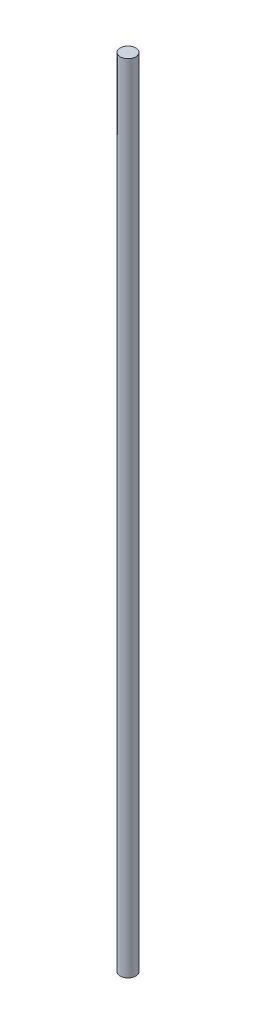
ISO-10303-21;
HEADER;
FILE_DESCRIPTION(('STEP AP214'),'2;1');
FILE_NAME('part.step','',(''),(''),'','','');
FILE_SCHEMA(('AUTOMOTIVE_DESIGN { 1 0 10303 214 1 1 1 1 }'));
ENDSEC;
DATA;
#1=APPLICATION_CONTEXT('core data for automotive mechanical design processes');
#2=APPLICATION_PROTOCOL_DEFINITION('international standard','automotive_design',2000,#1);
#3=PRODUCT_CONTEXT('',#1,'mechanical');
#4=PRODUCT('Part','Part','',(#3));
#5=PRODUCT_RELATED_PRODUCT_CATEGORY('part','',(#4));
#6=PRODUCT_DEFINITION_FORMATION('','',#4);
#7=PRODUCT_DEFINITION_CONTEXT('part definition',#1,'design');
#8=PRODUCT_DEFINITION('design','',#6,#7);
#9=PRODUCT_DEFINITION_SHAPE('','',#8);
#10=(LENGTH_UNIT() NAMED_UNIT(*) SI_UNIT(.MILLI.,.METRE.));
#11=(NAMED_UNIT(*) PLANE_ANGLE_UNIT() SI_UNIT($,.RADIAN.));
#12=(NAMED_UNIT(*) SI_UNIT($,.STERADIAN.) SOLID_ANGLE_UNIT());
#13=UNCERTAINTY_MEASURE_WITH_UNIT(LENGTH_MEASURE(1.E-05),#10,'distance_accuracy_value','');
#14=(GEOMETRIC_REPRESENTATION_CONTEXT(3) GLOBAL_UNCERTAINTY_ASSIGNED_CONTEXT((#13)) GLOBAL_UNIT_ASSIGNED_CONTEXT((#10,
#11,#12)) REPRESENTATION_CONTEXT('',''));
#15=CARTESIAN_POINT('',(0.,0.,0.));
#16=DIRECTION('',(0.,0.,1.));
#17=DIRECTION('',(1.,0.,0.));
#18=AXIS2_PLACEMENT_3D('',#15,#16,#17);
#19=CARTESIAN_POINT('',(0.,410.,0.));
#20=DIRECTION('',(0.,-1.,0.));
#21=DIRECTION('',(0.,0.,-1.));
#22=AXIS2_PLACEMENT_3D('',#19,#20,#21);
#23=CYLINDRICAL_SURFACE('',#22,4.);
#24=CARTESIAN_POINT('',(0.,410.,0.));
#25=DIRECTION('',(0.,1.,0.));
#26=DIRECTION('',(0.,0.,1.));
#27=AXIS2_PLACEMENT_3D('',#24,#25,#26);
#28=CIRCLE('',#27,4.);
#29=CARTESIAN_POINT('',(0.,410.,-4.));
#30=VERTEX_POINT('',#29);
#31=EDGE_CURVE('E10',#30,#30,#28,.T.);
#32=CARTESIAN_POINT('',(0.,0.,0.));
#33=DIRECTION('',(0.,1.,0.));
#34=DIRECTION('',(0.,0.,1.));
#35=AXIS2_PLACEMENT_3D('',#32,#33,#34);
#36=CIRCLE('',#35,4.);
#37=CARTESIAN_POINT('',(0.,0.,-4.));
#38=VERTEX_POINT('',#37);
#39=EDGE_CURVE('E34',#38,#38,#36,.T.);
#40=CARTESIAN_POINT('',(0.,410.,-4.));
#41=CARTESIAN_POINT('',(0.,405.729166666667,-4.));
#42=CARTESIAN_POINT('',(0.,401.458333333333,-4.));
#43=CARTESIAN_POINT('',(0.,392.916666666667,-4.));
#44=CARTESIAN_POINT('',(0.,388.645833333333,-4.));
#45=CARTESIAN_POINT('',(0.,380.104166666667,-4.));
#46=CARTESIAN_POINT('',(0.,375.833333333333,-4.));
#47=CARTESIAN_POINT('',(0.,367.291666666667,-4.));
#48=CARTESIAN_POINT('',(0.,363.020833333333,-4.));
#49=CARTESIAN_POINT('',(0.,354.479166666667,-4.));
#50=CARTESIAN_POINT('',(0.,350.208333333333,-4.));
#51=CARTESIAN_POINT('',(0.,341.666666666667,-4.));
#52=CARTESIAN_POINT('',(0.,337.395833333333,-4.));
#53=CARTESIAN_POINT('',(0.,328.854166666667,-4.));
#54=CARTESIAN_POINT('',(0.,324.583333333333,-4.));
#55=CARTESIAN_POINT('',(0.,316.041666666667,-4.));
#56=CARTESIAN_POINT('',(0.,311.770833333333,-4.));
#57=CARTESIAN_POINT('',(0.,303.229166666667,-4.));
#58=CARTESIAN_POINT('',(0.,298.958333333333,-4.));
#59=CARTESIAN_POINT('',(0.,290.416666666667,-4.));
#60=CARTESIAN_POINT('',(0.,286.145833333333,-4.));
#61=CARTESIAN_POINT('',(0.,277.604166666667,-4.));
#62=CARTESIAN_POINT('',(0.,273.333333333333,-4.));
#63=CARTESIAN_POINT('',(0.,264.791666666667,-4.));
#64=CARTESIAN_POINT('',(0.,260.520833333333,-4.));
#65=CARTESIAN_POINT('',(0.,251.979166666667,-4.));
#66=CARTESIAN_POINT('',(0.,247.708333333333,-4.));
#67=CARTESIAN_POINT('',(0.,239.166666666667,-4.));
#68=CARTESIAN_POINT('',(0.,234.895833333333,-4.));
#69=CARTESIAN_POINT('',(0.,226.354166666667,-4.));
#70=CARTESIAN_POINT('',(0.,222.083333333333,-4.));
#71=CARTESIAN_POINT('',(0.,213.541666666667,-4.));
#72=CARTESIAN_POINT('',(0.,209.270833333333,-4.));
#73=CARTESIAN_POINT('',(0.,200.729166666667,-4.));
#74=CARTESIAN_POINT('',(0.,196.458333333333,-4.));
#75=CARTESIAN_POINT('',(0.,187.916666666667,-4.));
#76=CARTESIAN_POINT('',(0.,183.645833333333,-4.));
#77=CARTESIAN_POINT('',(0.,175.104166666667,-4.));
#78=CARTESIAN_POINT('',(0.,170.833333333333,-4.));
#79=CARTESIAN_POINT('',(0.,162.291666666667,-4.));
#80=CARTESIAN_POINT('',(0.,158.020833333333,-4.));
#81=CARTESIAN_POINT('',(0.,149.479166666667,-4.));
#82=CARTESIAN_POINT('',(0.,145.208333333333,-4.));
#83=CARTESIAN_POINT('',(0.,136.666666666667,-4.));
#84=CARTESIAN_POINT('',(0.,132.395833333333,-4.));
#85=CARTESIAN_POINT('',(0.,123.854166666667,-4.));
#86=CARTESIAN_POINT('',(0.,119.583333333333,-4.));
#87=CARTESIAN_POINT('',(0.,111.041666666667,-4.));
#88=CARTESIAN_POINT('',(0.,106.770833333333,-4.));
#89=CARTESIAN_POINT('',(0.,98.2291666666667,-4.));
#90=CARTESIAN_POINT('',(0.,93.9583333333334,-4.));
#91=CARTESIAN_POINT('',(0.,85.4166666666667,-4.));
#92=CARTESIAN_POINT('',(0.,81.1458333333334,-4.));
#93=CARTESIAN_POINT('',(0.,72.6041666666667,-4.));
#94=CARTESIAN_POINT('',(0.,68.3333333333334,-4.));
#95=CARTESIAN_POINT('',(0.,59.7916666666667,-4.));
#96=CARTESIAN_POINT('',(0.,55.5208333333333,-4.));
#97=CARTESIAN_POINT('',(0.,46.9791666666667,-4.));
#98=CARTESIAN_POINT('',(0.,42.7083333333333,-4.));
#99=CARTESIAN_POINT('',(0.,34.1666666666667,-4.));
#100=CARTESIAN_POINT('',(0.,29.8958333333333,-4.));
#101=CARTESIAN_POINT('',(0.,21.3541666666667,-4.));
#102=CARTESIAN_POINT('',(0.,17.0833333333333,-4.));
#103=CARTESIAN_POINT('',(0.,8.54166666666667,-4.));
#104=CARTESIAN_POINT('',(0.,4.27083333333333,-4.));
#105=CARTESIAN_POINT('',(0.,0.,-4.));
#106=B_SPLINE_CURVE_WITH_KNOTS('',3,(#40,#41,#42,#43,#44,#45,#46,#47,#48,#49,#50,#51,#52,#53,
#54,#55,#56,#57,#58,#59,#60,#61,#62,#63,#64,#65,#66,#67,#68,#69,#70,#71,#72,#73,#74,#75,#76,#77,
#78,#79,#80,#81,#82,#83,#84,#85,#86,#87,#88,#89,#90,#91,#92,#93,#94,#95,#96,#97,#98,#99,#100,
#101,#102,#103,#104,#105),.UNSPECIFIED.,.F.,.F.,(4,2,2,2,2,2,2,2,2,2,2,2,2,2,2,2,2,2,2,2,2,2,2,
2,2,2,2,2,2,2,2,2,4),(0.,12.8125,25.625,38.4375,51.25,64.0625,76.875,89.6875,102.5,115.3125,
128.125,140.9375,153.75,166.5625,179.375,192.1875,205.,217.8125,230.625,243.4375,256.25,
269.0625,281.875,294.6875,307.5,320.3125,333.125,345.9375,358.75,371.5625,384.375,397.1875,
410.),.UNSPECIFIED.);
#107=EDGE_CURVE('BSEAM31',#30,#38,#106,.T.);
#108=ORIENTED_EDGE('',*,*,#31,.F.);
#109=ORIENTED_EDGE('',*,*,#39,.T.);
#110=ORIENTED_EDGE('',*,*,#107,.T.);
#111=ORIENTED_EDGE('',*,*,#107,.F.);
#112=EDGE_LOOP('',(#108,#110,#109,#111));
#113=FACE_BOUND('',#112,.T.);
#114=ADVANCED_FACE('F31',(#113),#23,.T.);
#115=CARTESIAN_POINT('',(0.,410.,0.));
#116=DIRECTION('',(0.,1.,0.));
#117=DIRECTION('',(0.,0.,1.));
#118=AXIS2_PLACEMENT_3D('',#115,#116,#117);
#119=PLANE('',#118);
#120=ORIENTED_EDGE('',*,*,#31,.T.);
#121=EDGE_LOOP('',(#120));
#122=FACE_BOUND('',#121,.T.);
#123=ADVANCED_FACE('F46',(#122),#119,.T.);
#124=CARTESIAN_POINT('',(0.,0.,0.));
#125=DIRECTION('',(0.,1.,0.));
#126=DIRECTION('',(0.,0.,1.));
#127=AXIS2_PLACEMENT_3D('',#124,#125,#126);
#128=PLANE('',#127);
#129=ORIENTED_EDGE('',*,*,#39,.F.);
#130=EDGE_LOOP('',(#129));
#131=FACE_BOUND('',#130,.T.);
#132=ADVANCED_FACE('F44',(#131),#128,.F.);
#133=CLOSED_SHELL('',(#114,#123,#132));
#134=MANIFOLD_SOLID_BREP('B2',#133);
#135=ADVANCED_BREP_SHAPE_REPRESENTATION('',(#18,#134),#14);
#136=SHAPE_DEFINITION_REPRESENTATION(#9,#135);
ENDSEC;
END-ISO-10303-21;
